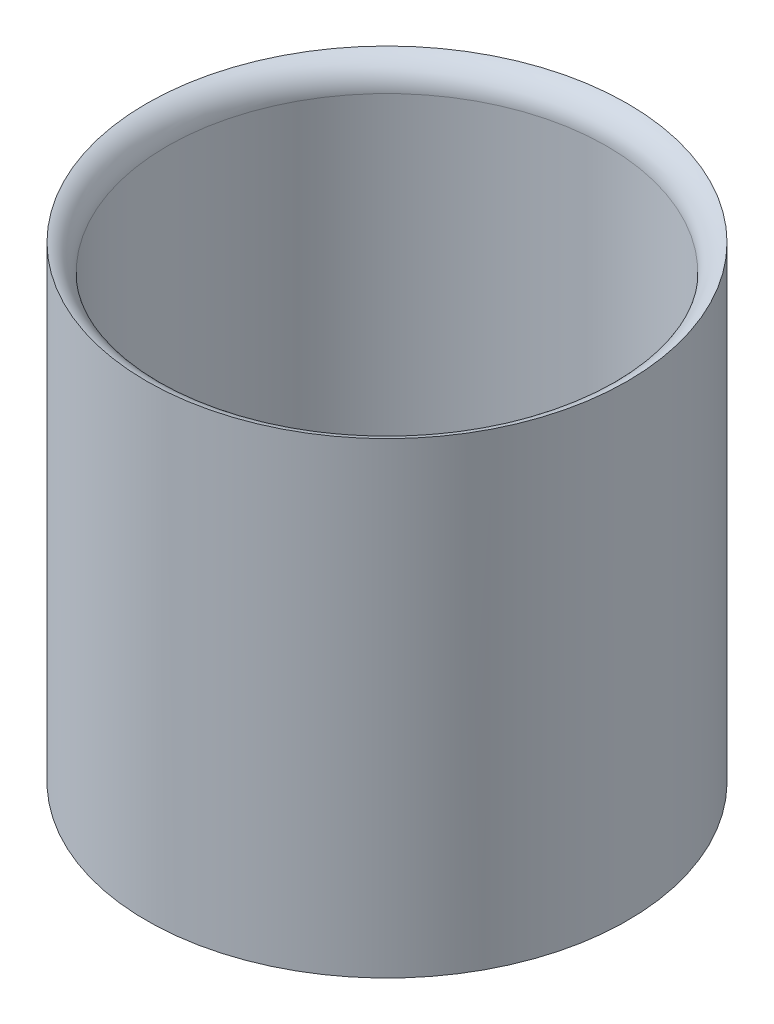
ISO-10303-21;
HEADER;
FILE_DESCRIPTION(('STEP AP214'),'2;1');
FILE_NAME('part.step','',(''),(''),'','','');
FILE_SCHEMA(('AUTOMOTIVE_DESIGN { 1 0 10303 214 1 1 1 1 }'));
ENDSEC;
DATA;
#1=APPLICATION_CONTEXT('core data for automotive mechanical design processes');
#2=APPLICATION_PROTOCOL_DEFINITION('international standard','automotive_design',2000,#1);
#3=PRODUCT_CONTEXT('',#1,'mechanical');
#4=PRODUCT('Part','Part','',(#3));
#5=PRODUCT_RELATED_PRODUCT_CATEGORY('part','',(#4));
#6=PRODUCT_DEFINITION_FORMATION('','',#4);
#7=PRODUCT_DEFINITION_CONTEXT('part definition',#1,'design');
#8=PRODUCT_DEFINITION('design','',#6,#7);
#9=PRODUCT_DEFINITION_SHAPE('','',#8);
#10=(LENGTH_UNIT() NAMED_UNIT(*) SI_UNIT(.MILLI.,.METRE.));
#11=(NAMED_UNIT(*) PLANE_ANGLE_UNIT() SI_UNIT($,.RADIAN.));
#12=(NAMED_UNIT(*) SI_UNIT($,.STERADIAN.) SOLID_ANGLE_UNIT());
#13=UNCERTAINTY_MEASURE_WITH_UNIT(LENGTH_MEASURE(1.E-05),#10,'distance_accuracy_value','');
#14=(GEOMETRIC_REPRESENTATION_CONTEXT(3) GLOBAL_UNCERTAINTY_ASSIGNED_CONTEXT((#13)) GLOBAL_UNIT_ASSIGNED_CONTEXT((#10,
#11,#12)) REPRESENTATION_CONTEXT('',''));
#15=CARTESIAN_POINT('',(0.,0.,0.));
#16=DIRECTION('',(0.,0.,1.));
#17=DIRECTION('',(1.,0.,0.));
#18=AXIS2_PLACEMENT_3D('',#15,#16,#17);
#19=CARTESIAN_POINT('',(0.,34.,0.));
#20=DIRECTION('',(0.,-1.,0.));
#21=DIRECTION('',(0.,0.,-1.));
#22=AXIS2_PLACEMENT_3D('',#19,#20,#21);
#23=CYLINDRICAL_SURFACE('',#22,16.);
#24=CARTESIAN_POINT('',(0.,32.0635083268963,0.));
#25=DIRECTION('',(0.,1.,0.));
#26=DIRECTION('',(0.,0.,1.));
#27=AXIS2_PLACEMENT_3D('',#24,#25,#26);
#28=CIRCLE('',#27,16.);
#29=CARTESIAN_POINT('',(0.,32.0635083268963,16.));
#30=VERTEX_POINT('',#29);
#31=EDGE_CURVE('E43',#30,#30,#28,.T.);
#32=ORIENTED_EDGE('',*,*,#31,.T.);
#33=EDGE_LOOP('',(#32));
#34=FACE_BOUND('',#33,.T.);
#35=CARTESIAN_POINT('',(0.,3.,0.));
#36=DIRECTION('',(0.,-1.,0.));
#37=DIRECTION('',(0.,0.,-1.));
#38=AXIS2_PLACEMENT_3D('',#35,#36,#37);
#39=CIRCLE('',#38,16.);
#40=CARTESIAN_POINT('',(0.,3.,-16.));
#41=VERTEX_POINT('',#40);
#42=EDGE_CURVE('E39',#41,#41,#39,.T.);
#43=ORIENTED_EDGE('',*,*,#42,.T.);
#44=EDGE_LOOP('',(#43));
#45=FACE_BOUND('',#44,.T.);
#46=ADVANCED_FACE('F35',(#34,#45),#23,.F.);
#47=CARTESIAN_POINT('',(0.,34.,0.));
#48=DIRECTION('',(0.,-1.,0.));
#49=DIRECTION('',(0.,0.,-1.));
#50=AXIS2_PLACEMENT_3D('',#47,#48,#49);
#51=CYLINDRICAL_SURFACE('',#50,17.5);
#52=CARTESIAN_POINT('',(0.,0.,0.));
#53=DIRECTION('',(0.,-1.,0.));
#54=DIRECTION('',(0.,0.,-1.));
#55=AXIS2_PLACEMENT_3D('',#52,#53,#54);
#56=CIRCLE('',#55,17.5);
#57=CARTESIAN_POINT('',(0.,0.,-17.5));
#58=VERTEX_POINT('',#57);
#59=EDGE_CURVE('E47',#58,#58,#56,.T.);
#60=ORIENTED_EDGE('',*,*,#59,.F.);
#61=EDGE_LOOP('',(#60));
#62=FACE_BOUND('',#61,.T.);
#63=CARTESIAN_POINT('',(0.,34.,0.));
#64=DIRECTION('',(0.,1.,0.));
#65=DIRECTION('',(0.,0.,1.));
#66=AXIS2_PLACEMENT_3D('',#63,#64,#65);
#67=CIRCLE('',#66,17.5);
#68=CARTESIAN_POINT('',(0.,34.,17.5));
#69=VERTEX_POINT('',#68);
#70=EDGE_CURVE('E10',#69,#69,#67,.T.);
#71=ORIENTED_EDGE('',*,*,#70,.F.);
#72=EDGE_LOOP('',(#71));
#73=FACE_BOUND('',#72,.T.);
#74=ADVANCED_FACE('F37',(#62,#73),#51,.T.);
#75=CARTESIAN_POINT('',(0.,32.0635083268963,0.));
#76=DIRECTION('',(0.,1.,0.));
#77=DIRECTION('',(0.,0.,1.));
#78=AXIS2_PLACEMENT_3D('',#75,#76,#77);
#79=TOROIDAL_SURFACE('',#78,18.,2.);
#80=ORIENTED_EDGE('',*,*,#70,.T.);
#81=EDGE_LOOP('',(#80));
#82=FACE_BOUND('',#81,.T.);
#83=ORIENTED_EDGE('',*,*,#31,.F.);
#84=EDGE_LOOP('',(#83));
#85=FACE_BOUND('',#84,.T.);
#86=ADVANCED_FACE('F74',(#82,#85),#79,.T.);
#87=CARTESIAN_POINT('',(0.,0.,0.));
#88=DIRECTION('',(0.,-1.,0.));
#89=DIRECTION('',(0.,0.,-1.));
#90=AXIS2_PLACEMENT_3D('',#87,#88,#89);
#91=PLANE('',#90);
#92=ORIENTED_EDGE('',*,*,#59,.T.);
#93=EDGE_LOOP('',(#92));
#94=FACE_BOUND('',#93,.T.);
#95=CARTESIAN_POINT('',(0.,0.,0.));
#96=DIRECTION('',(0.,-1.,0.));
#97=DIRECTION('',(0.,0.,-1.));
#98=AXIS2_PLACEMENT_3D('',#95,#96,#97);
#99=CIRCLE('',#98,12.5);
#100=CARTESIAN_POINT('',(0.,0.,-12.5));
#101=VERTEX_POINT('',#100);
#102=EDGE_CURVE('E52',#101,#101,#99,.T.);
#103=ORIENTED_EDGE('',*,*,#102,.F.);
#104=EDGE_LOOP('',(#103));
#105=FACE_BOUND('',#104,.T.);
#106=ADVANCED_FACE('F66',(#94,#105),#91,.T.);
#107=CARTESIAN_POINT('',(0.,3.,0.));
#108=DIRECTION('',(0.,-1.,0.));
#109=DIRECTION('',(0.,0.,-1.));
#110=AXIS2_PLACEMENT_3D('',#107,#108,#109);
#111=PLANE('',#110);
#112=CARTESIAN_POINT('',(0.,3.,0.));
#113=DIRECTION('',(0.,-1.,0.));
#114=DIRECTION('',(0.,0.,-1.));
#115=AXIS2_PLACEMENT_3D('',#112,#113,#114);
#116=CIRCLE('',#115,12.5);
#117=CARTESIAN_POINT('',(0.,3.,-12.5));
#118=VERTEX_POINT('',#117);
#119=EDGE_CURVE('E55',#118,#118,#116,.T.);
#120=ORIENTED_EDGE('',*,*,#119,.T.);
#121=EDGE_LOOP('',(#120));
#122=FACE_BOUND('',#121,.T.);
#123=ORIENTED_EDGE('',*,*,#42,.F.);
#124=EDGE_LOOP('',(#123));
#125=FACE_BOUND('',#124,.T.);
#126=ADVANCED_FACE('F63',(#122,#125),#111,.F.);
#127=CARTESIAN_POINT('',(0.,3.,0.));
#128=DIRECTION('',(0.,-1.,0.));
#129=DIRECTION('',(0.,0.,-1.));
#130=AXIS2_PLACEMENT_3D('',#127,#128,#129);
#131=CYLINDRICAL_SURFACE('',#130,12.5);
#132=ORIENTED_EDGE('',*,*,#119,.F.);
#133=EDGE_LOOP('',(#132));
#134=FACE_BOUND('',#133,.T.);
#135=ORIENTED_EDGE('',*,*,#102,.T.);
#136=EDGE_LOOP('',(#135));
#137=FACE_BOUND('',#136,.T.);
#138=ADVANCED_FACE('F65',(#134,#137),#131,.F.);
#139=CLOSED_SHELL('',(#46,#74,#86,#106,#126,#138));
#140=MANIFOLD_SOLID_BREP('B2',#139);
#141=ADVANCED_BREP_SHAPE_REPRESENTATION('',(#18,#140),#14);
#142=SHAPE_DEFINITION_REPRESENTATION(#9,#141);
ENDSEC;
END-ISO-10303-21;
